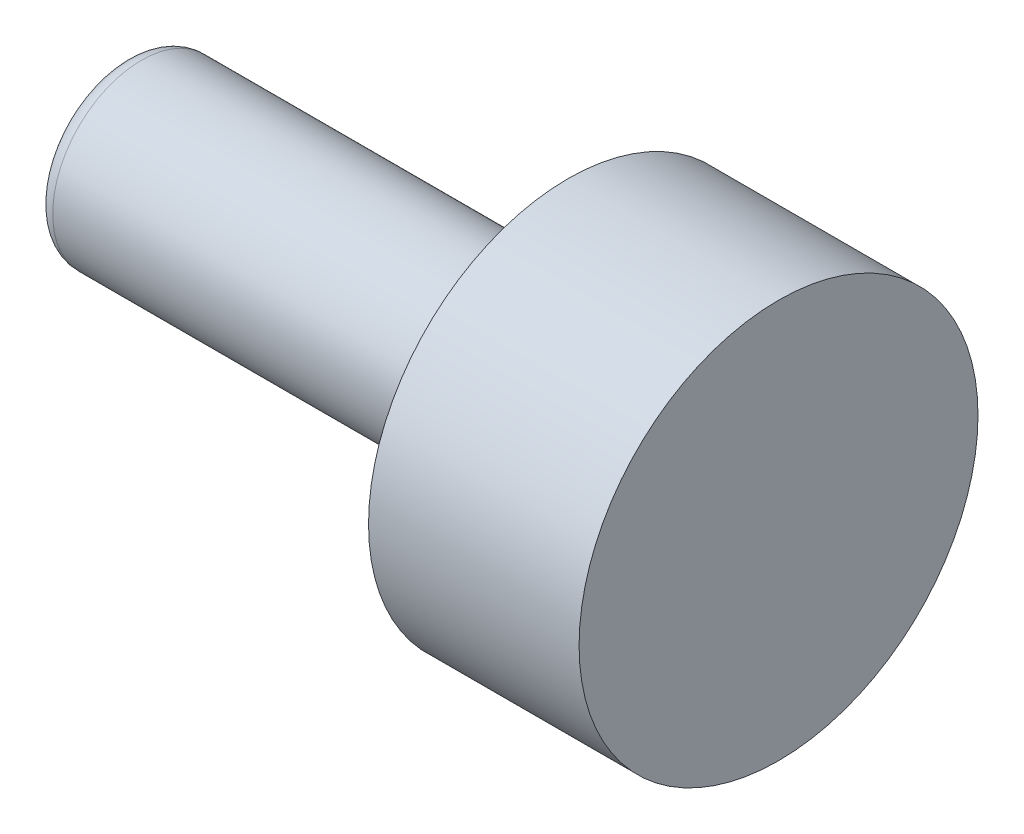
ISO-10303-21;
HEADER;
FILE_DESCRIPTION(('STEP AP214'),'2;1');
FILE_NAME('part.step','',(''),(''),'','','');
FILE_SCHEMA(('AUTOMOTIVE_DESIGN { 1 0 10303 214 1 1 1 1 }'));
ENDSEC;
DATA;
#1=APPLICATION_CONTEXT('core data for automotive mechanical design processes');
#2=APPLICATION_PROTOCOL_DEFINITION('international standard','automotive_design',2000,#1);
#3=PRODUCT_CONTEXT('',#1,'mechanical');
#4=PRODUCT('Part','Part','',(#3));
#5=PRODUCT_RELATED_PRODUCT_CATEGORY('part','',(#4));
#6=PRODUCT_DEFINITION_FORMATION('','',#4);
#7=PRODUCT_DEFINITION_CONTEXT('part definition',#1,'design');
#8=PRODUCT_DEFINITION('design','',#6,#7);
#9=PRODUCT_DEFINITION_SHAPE('','',#8);
#10=(LENGTH_UNIT() NAMED_UNIT(*) SI_UNIT(.MILLI.,.METRE.));
#11=(NAMED_UNIT(*) PLANE_ANGLE_UNIT() SI_UNIT($,.RADIAN.));
#12=(NAMED_UNIT(*) SI_UNIT($,.STERADIAN.) SOLID_ANGLE_UNIT());
#13=UNCERTAINTY_MEASURE_WITH_UNIT(LENGTH_MEASURE(1.E-05),#10,'distance_accuracy_value','');
#14=(GEOMETRIC_REPRESENTATION_CONTEXT(3) GLOBAL_UNCERTAINTY_ASSIGNED_CONTEXT((#13)) GLOBAL_UNIT_ASSIGNED_CONTEXT((#10,
#11,#12)) REPRESENTATION_CONTEXT('',''));
#15=CARTESIAN_POINT('',(0.,0.,0.));
#16=DIRECTION('',(0.,0.,1.));
#17=DIRECTION('',(1.,0.,0.));
#18=AXIS2_PLACEMENT_3D('',#15,#16,#17);
#19=CARTESIAN_POINT('',(80.,0.,0.));
#20=DIRECTION('',(-1.,0.,0.));
#21=DIRECTION('',(0.,0.,1.));
#22=AXIS2_PLACEMENT_3D('',#19,#20,#21);
#23=CYLINDRICAL_SURFACE('',#22,16.);
#24=CARTESIAN_POINT('',(77.,0.,0.));
#25=DIRECTION('',(1.,0.,0.));
#26=DIRECTION('',(0.,0.,-1.));
#27=AXIS2_PLACEMENT_3D('',#24,#25,#26);
#28=CIRCLE('',#27,16.);
#29=CARTESIAN_POINT('',(77.,0.,-16.));
#30=VERTEX_POINT('',#29);
#31=EDGE_CURVE('E38',#30,#30,#28,.F.);
#32=ORIENTED_EDGE('',*,*,#31,.T.);
#33=EDGE_LOOP('',(#32));
#34=FACE_BOUND('',#33,.T.);
#35=CARTESIAN_POINT('',(3.,0.,0.));
#36=DIRECTION('',(1.,0.,0.));
#37=DIRECTION('',(0.,0.,-1.));
#38=AXIS2_PLACEMENT_3D('',#35,#36,#37);
#39=CIRCLE('',#38,16.);
#40=CARTESIAN_POINT('',(3.,0.,-16.));
#41=VERTEX_POINT('',#40);
#42=EDGE_CURVE('E42',#41,#41,#39,.T.);
#43=ORIENTED_EDGE('',*,*,#42,.T.);
#44=EDGE_LOOP('',(#43));
#45=FACE_BOUND('',#44,.T.);
#46=ADVANCED_FACE('F31',(#34,#45),#23,.T.);
#47=CARTESIAN_POINT('',(0.,0.,0.));
#48=DIRECTION('',(1.,0.,0.));
#49=DIRECTION('',(0.,0.,-1.));
#50=AXIS2_PLACEMENT_3D('',#47,#48,#49);
#51=PLANE('',#50);
#52=CARTESIAN_POINT('',(0.,0.,0.));
#53=DIRECTION('',(1.,0.,0.));
#54=DIRECTION('',(0.,0.,-1.));
#55=AXIS2_PLACEMENT_3D('',#52,#53,#54);
#56=CIRCLE('',#55,13.);
#57=CARTESIAN_POINT('',(0.,0.,-13.));
#58=VERTEX_POINT('',#57);
#59=EDGE_CURVE('E10',#58,#58,#56,.F.);
#60=ORIENTED_EDGE('',*,*,#59,.T.);
#61=EDGE_LOOP('',(#60));
#62=FACE_BOUND('',#61,.T.);
#63=ADVANCED_FACE('F63',(#62),#51,.F.);
#64=CARTESIAN_POINT('',(118.,0.,0.));
#65=DIRECTION('',(-1.,0.,0.));
#66=DIRECTION('',(0.,0.,1.));
#67=AXIS2_PLACEMENT_3D('',#64,#65,#66);
#68=CYLINDRICAL_SURFACE('',#67,36.);
#69=CARTESIAN_POINT('',(118.,0.,0.));
#70=DIRECTION('',(1.,0.,0.));
#71=DIRECTION('',(0.,0.,-1.));
#72=AXIS2_PLACEMENT_3D('',#69,#70,#71);
#73=CIRCLE('',#72,36.);
#74=CARTESIAN_POINT('',(118.,0.,-36.));
#75=VERTEX_POINT('',#74);
#76=EDGE_CURVE('E51',#75,#75,#73,.T.);
#77=ORIENTED_EDGE('',*,*,#76,.F.);
#78=EDGE_LOOP('',(#77));
#79=FACE_BOUND('',#78,.T.);
#80=CARTESIAN_POINT('',(80.,0.,0.));
#81=DIRECTION('',(1.,0.,0.));
#82=DIRECTION('',(0.,0.,-1.));
#83=AXIS2_PLACEMENT_3D('',#80,#81,#82);
#84=CIRCLE('',#83,36.);
#85=CARTESIAN_POINT('',(80.,0.,-36.));
#86=VERTEX_POINT('',#85);
#87=EDGE_CURVE('E52',#86,#86,#84,.T.);
#88=ORIENTED_EDGE('',*,*,#87,.T.);
#89=EDGE_LOOP('',(#88));
#90=FACE_BOUND('',#89,.T.);
#91=ADVANCED_FACE('F60',(#79,#90),#68,.T.);
#92=CARTESIAN_POINT('',(118.,0.,0.));
#93=DIRECTION('',(1.,0.,0.));
#94=DIRECTION('',(0.,0.,-1.));
#95=AXIS2_PLACEMENT_3D('',#92,#93,#94);
#96=PLANE('',#95);
#97=ORIENTED_EDGE('',*,*,#76,.T.);
#98=EDGE_LOOP('',(#97));
#99=FACE_BOUND('',#98,.T.);
#100=ADVANCED_FACE('F58',(#99),#96,.T.);
#101=CARTESIAN_POINT('',(80.,0.,0.));
#102=DIRECTION('',(1.,0.,0.));
#103=DIRECTION('',(0.,0.,-1.));
#104=AXIS2_PLACEMENT_3D('',#101,#102,#103);
#105=PLANE('',#104);
#106=CARTESIAN_POINT('',(80.,0.,0.));
#107=DIRECTION('',(1.,0.,0.));
#108=DIRECTION('',(0.,0.,-1.));
#109=AXIS2_PLACEMENT_3D('',#106,#107,#108);
#110=CIRCLE('',#109,19.);
#111=CARTESIAN_POINT('',(80.,0.,-19.));
#112=VERTEX_POINT('',#111);
#113=EDGE_CURVE('E46',#112,#112,#110,.T.);
#114=ORIENTED_EDGE('',*,*,#113,.T.);
#115=EDGE_LOOP('',(#114));
#116=FACE_BOUND('',#115,.T.);
#117=ORIENTED_EDGE('',*,*,#87,.F.);
#118=EDGE_LOOP('',(#117));
#119=FACE_BOUND('',#118,.T.);
#120=ADVANCED_FACE('F67',(#116,#119),#105,.F.);
#121=CARTESIAN_POINT('',(77.,0.,0.));
#122=DIRECTION('',(1.,0.,0.));
#123=DIRECTION('',(0.,0.,-1.));
#124=AXIS2_PLACEMENT_3D('',#121,#122,#123);
#125=TOROIDAL_SURFACE('',#124,19.,3.);
#126=ORIENTED_EDGE('',*,*,#31,.F.);
#127=EDGE_LOOP('',(#126));
#128=FACE_BOUND('',#127,.T.);
#129=ORIENTED_EDGE('',*,*,#113,.F.);
#130=EDGE_LOOP('',(#129));
#131=FACE_BOUND('',#130,.T.);
#132=ADVANCED_FACE('F69',(#128,#131),#125,.F.);
#133=CARTESIAN_POINT('',(3.,0.,0.));
#134=DIRECTION('',(1.,0.,0.));
#135=DIRECTION('',(0.,0.,-1.));
#136=AXIS2_PLACEMENT_3D('',#133,#134,#135);
#137=TOROIDAL_SURFACE('',#136,13.,3.);
#138=ORIENTED_EDGE('',*,*,#59,.F.);
#139=EDGE_LOOP('',(#138));
#140=FACE_BOUND('',#139,.T.);
#141=ORIENTED_EDGE('',*,*,#42,.F.);
#142=EDGE_LOOP('',(#141));
#143=FACE_BOUND('',#142,.T.);
#144=ADVANCED_FACE('F33',(#140,#143),#137,.T.);
#145=CLOSED_SHELL('',(#46,#63,#91,#100,#120,#132,#144));
#146=MANIFOLD_SOLID_BREP('B2',#145);
#147=ADVANCED_BREP_SHAPE_REPRESENTATION('',(#18,#146),#14);
#148=SHAPE_DEFINITION_REPRESENTATION(#9,#147);
ENDSEC;
END-ISO-10303-21;
